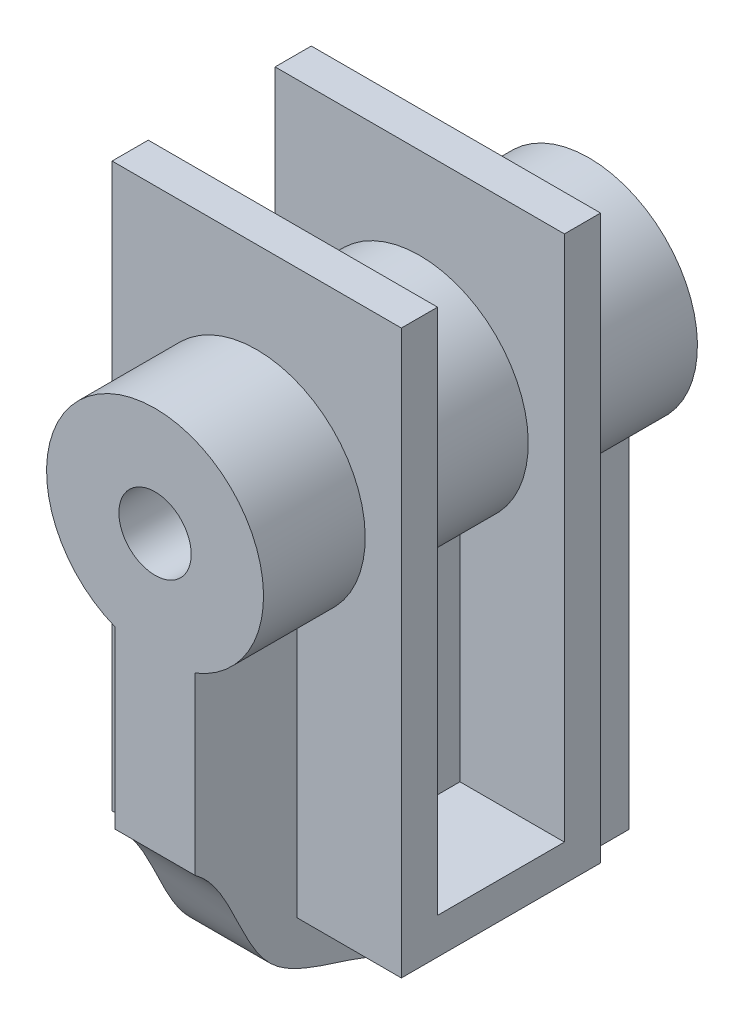
ISO-10303-21;
HEADER;
FILE_DESCRIPTION(('STEP AP214'),'2;1');
FILE_NAME('part.step','',(''),(''),'','','');
FILE_SCHEMA(('AUTOMOTIVE_DESIGN { 1 0 10303 214 1 1 1 1 }'));
ENDSEC;
DATA;
#1=APPLICATION_CONTEXT('core data for automotive mechanical design processes');
#2=APPLICATION_PROTOCOL_DEFINITION('international standard','automotive_design',2000,#1);
#3=PRODUCT_CONTEXT('',#1,'mechanical');
#4=PRODUCT('Part','Part','',(#3));
#5=PRODUCT_RELATED_PRODUCT_CATEGORY('part','',(#4));
#6=PRODUCT_DEFINITION_FORMATION('','',#4);
#7=PRODUCT_DEFINITION_CONTEXT('part definition',#1,'design');
#8=PRODUCT_DEFINITION('design','',#6,#7);
#9=PRODUCT_DEFINITION_SHAPE('','',#8);
#10=(LENGTH_UNIT() NAMED_UNIT(*) SI_UNIT(.MILLI.,.METRE.));
#11=(NAMED_UNIT(*) PLANE_ANGLE_UNIT() SI_UNIT($,.RADIAN.));
#12=(NAMED_UNIT(*) SI_UNIT($,.STERADIAN.) SOLID_ANGLE_UNIT());
#13=UNCERTAINTY_MEASURE_WITH_UNIT(LENGTH_MEASURE(1.E-05),#10,'distance_accuracy_value','');
#14=(GEOMETRIC_REPRESENTATION_CONTEXT(3) GLOBAL_UNCERTAINTY_ASSIGNED_CONTEXT((#13)) GLOBAL_UNIT_ASSIGNED_CONTEXT((#10,
#11,#12)) REPRESENTATION_CONTEXT('',''));
#15=CARTESIAN_POINT('',(0.,0.,0.));
#16=DIRECTION('',(0.,0.,1.));
#17=DIRECTION('',(1.,0.,0.));
#18=AXIS2_PLACEMENT_3D('',#15,#16,#17);
#19=CARTESIAN_POINT('',(-20.,-45.2531458099855,-6.6055019568257));
#20=DIRECTION('',(0.,1.,0.));
#21=DIRECTION('',(0.,0.,1.));
#22=AXIS2_PLACEMENT_3D('',#19,#20,#21);
#23=PLANE('',#22);
#24=DIRECTION('',(1.,0.,0.));
#25=VECTOR('',#24,1.);
#26=CARTESIAN_POINT('',(-20.,-45.2531458099855,10.9381302617935));
#27=LINE('',#26,#25);
#28=CARTESIAN_POINT('',(-20.,-45.2531458099855,10.9381302617935));
#29=VERTEX_POINT('',#28);
#30=CARTESIAN_POINT('',(20.,-45.2531458099855,10.9381302617935));
#31=VERTEX_POINT('',#30);
#32=EDGE_CURVE('E124',#29,#31,#27,.T.);
#33=ORIENTED_EDGE('',*,*,#32,.T.);
#34=DIRECTION('',(0.,0.,1.));
#35=VECTOR('',#34,1.);
#36=CARTESIAN_POINT('',(20.,-45.2531458099855,-6.6055019568257));
#37=LINE('',#36,#35);
#38=CARTESIAN_POINT('',(20.,-45.2531458099855,-6.6055019568257));
#39=VERTEX_POINT('',#38);
#40=EDGE_CURVE('E185',#39,#31,#37,.T.);
#41=ORIENTED_EDGE('',*,*,#40,.F.);
#42=DIRECTION('',(1.,0.,0.));
#43=VECTOR('',#42,1.);
#44=CARTESIAN_POINT('',(-20.,-45.2531458099855,-6.6055019568257));
#45=LINE('',#44,#43);
#46=CARTESIAN_POINT('',(-20.,-45.2531458099855,-6.6055019568257));
#47=VERTEX_POINT('',#46);
#48=EDGE_CURVE('E50',#47,#39,#45,.T.);
#49=ORIENTED_EDGE('',*,*,#48,.F.);
#50=DIRECTION('',(0.,0.,1.));
#51=VECTOR('',#50,1.);
#52=CARTESIAN_POINT('',(-20.,-45.2531458099855,-6.6055019568257));
#53=LINE('',#52,#51);
#54=EDGE_CURVE('E186',#47,#29,#53,.T.);
#55=ORIENTED_EDGE('',*,*,#54,.T.);
#56=EDGE_LOOP('',(#33,#41,#49,#55));
#57=FACE_BOUND('',#56,.T.);
#58=ADVANCED_FACE('F121',(#57),#23,.T.);
#59=CARTESIAN_POINT('',(-20.,-45.2531458099855,-6.6055019568257));
#60=DIRECTION('',(0.,0.,1.));
#61=DIRECTION('',(1.,0.,0.));
#62=AXIS2_PLACEMENT_3D('',#59,#60,#61);
#63=PLANE('',#62);
#64=ORIENTED_EDGE('',*,*,#48,.T.);
#65=DIRECTION('',(0.,-1.,0.));
#66=VECTOR('',#65,1.);
#67=CARTESIAN_POINT('',(20.,-45.2531458099855,-6.6055019568257));
#68=LINE('',#67,#66);
#69=CARTESIAN_POINT('',(20.,27.5804653060911,-6.6055019568257));
#70=VERTEX_POINT('',#69);
#71=EDGE_CURVE('E203',#70,#39,#68,.T.);
#72=ORIENTED_EDGE('',*,*,#71,.F.);
#73=DIRECTION('',(1.,0.,0.));
#74=VECTOR('',#73,1.);
#75=CARTESIAN_POINT('',(-20.,27.5804653060911,-6.6055019568257));
#76=LINE('',#75,#74);
#77=CARTESIAN_POINT('',(-20.,27.5804653060911,-6.6055019568257));
#78=VERTEX_POINT('',#77);
#79=EDGE_CURVE('E129',#78,#70,#76,.T.);
#80=ORIENTED_EDGE('',*,*,#79,.F.);
#81=DIRECTION('',(0.,-1.,0.));
#82=VECTOR('',#81,1.);
#83=CARTESIAN_POINT('',(-20.,-45.2531458099855,-6.6055019568257));
#84=LINE('',#83,#82);
#85=EDGE_CURVE('E191',#78,#47,#84,.T.);
#86=ORIENTED_EDGE('',*,*,#85,.T.);
#87=EDGE_LOOP('',(#64,#72,#80,#86));
#88=FACE_BOUND('',#87,.T.);
#89=ADVANCED_FACE('F267',(#88),#63,.T.);
#90=CARTESIAN_POINT('',(-20.,27.5804653060911,-6.6055019568257));
#91=DIRECTION('',(0.,1.,0.));
#92=DIRECTION('',(0.,0.,1.));
#93=AXIS2_PLACEMENT_3D('',#90,#91,#92);
#94=PLANE('',#93);
#95=ORIENTED_EDGE('',*,*,#79,.T.);
#96=DIRECTION('',(0.,0.,1.));
#97=VECTOR('',#96,1.);
#98=CARTESIAN_POINT('',(20.,27.5804653060911,-6.6055019568257));
#99=LINE('',#98,#97);
#100=CARTESIAN_POINT('',(20.,27.5804653060911,-11.6055019568257));
#101=VERTEX_POINT('',#100);
#102=EDGE_CURVE('E216',#101,#70,#99,.T.);
#103=ORIENTED_EDGE('',*,*,#102,.F.);
#104=DIRECTION('',(1.,0.,0.));
#105=VECTOR('',#104,1.);
#106=CARTESIAN_POINT('',(-20.,27.5804653060911,-11.6055019568257));
#107=LINE('',#106,#105);
#108=CARTESIAN_POINT('',(-20.,27.5804653060911,-11.6055019568257));
#109=VERTEX_POINT('',#108);
#110=EDGE_CURVE('E238',#109,#101,#107,.T.);
#111=ORIENTED_EDGE('',*,*,#110,.F.);
#112=DIRECTION('',(0.,0.,1.));
#113=VECTOR('',#112,1.);
#114=CARTESIAN_POINT('',(-20.,27.5804653060911,-6.6055019568257));
#115=LINE('',#114,#113);
#116=EDGE_CURVE('E234',#109,#78,#115,.T.);
#117=ORIENTED_EDGE('',*,*,#116,.T.);
#118=EDGE_LOOP('',(#95,#103,#111,#117));
#119=FACE_BOUND('',#118,.T.);
#120=ADVANCED_FACE('F266',(#119),#94,.T.);
#121=CARTESIAN_POINT('',(-20.,-50.2531458099855,-11.6055019568257));
#122=DIRECTION('',(0.,0.,-1.));
#123=DIRECTION('',(-1.,0.,0.));
#124=AXIS2_PLACEMENT_3D('',#121,#122,#123);
#125=PLANE('',#124);
#126=ORIENTED_EDGE('',*,*,#110,.T.);
#127=DIRECTION('',(0.,1.,0.));
#128=VECTOR('',#127,1.);
#129=CARTESIAN_POINT('',(20.,-50.2531458099855,-11.6055019568257));
#130=LINE('',#129,#128);
#131=CARTESIAN_POINT('',(20.,-50.2531458099855,-11.6055019568257));
#132=VERTEX_POINT('',#131);
#133=EDGE_CURVE('E213',#132,#101,#130,.T.);
#134=ORIENTED_EDGE('',*,*,#133,.F.);
#135=DIRECTION('',(1.,0.,0.));
#136=VECTOR('',#135,1.);
#137=CARTESIAN_POINT('',(-20.,-50.2531458099855,-11.6055019568257));
#138=LINE('',#137,#136);
#139=CARTESIAN_POINT('',(-20.,-50.2531458099855,-11.6055019568257));
#140=VERTEX_POINT('',#139);
#141=EDGE_CURVE('E240',#140,#132,#138,.T.);
#142=ORIENTED_EDGE('',*,*,#141,.F.);
#143=DIRECTION('',(0.,1.,0.));
#144=VECTOR('',#143,1.);
#145=CARTESIAN_POINT('',(-20.,-50.2531458099855,-11.6055019568257));
#146=LINE('',#145,#144);
#147=EDGE_CURVE('E231',#140,#109,#146,.T.);
#148=ORIENTED_EDGE('',*,*,#147,.T.);
#149=EDGE_LOOP('',(#126,#134,#142,#148));
#150=FACE_BOUND('',#149,.T.);
#151=ADVANCED_FACE('F262',(#150),#125,.T.);
#152=CARTESIAN_POINT('',(-20.,-50.2531458099855,-11.6055019568257));
#153=DIRECTION('',(0.,-1.,0.));
#154=DIRECTION('',(0.,0.,-1.));
#155=AXIS2_PLACEMENT_3D('',#152,#153,#154);
#156=PLANE('',#155);
#157=ORIENTED_EDGE('',*,*,#141,.T.);
#158=DIRECTION('',(0.,0.,-1.));
#159=VECTOR('',#158,1.);
#160=CARTESIAN_POINT('',(20.,-50.2531458099855,-11.6055019568257));
#161=LINE('',#160,#159);
#162=CARTESIAN_POINT('',(20.,-50.2531458099855,15.9381302617935));
#163=VERTEX_POINT('',#162);
#164=EDGE_CURVE('E210',#163,#132,#161,.T.);
#165=ORIENTED_EDGE('',*,*,#164,.F.);
#166=DIRECTION('',(1.,0.,0.));
#167=VECTOR('',#166,1.);
#168=CARTESIAN_POINT('',(-20.,-50.2531458099855,15.9381302617935));
#169=LINE('',#168,#167);
#170=CARTESIAN_POINT('',(-20.,-50.2531458099855,15.9381302617935));
#171=VERTEX_POINT('',#170);
#172=EDGE_CURVE('E242',#171,#163,#169,.T.);
#173=ORIENTED_EDGE('',*,*,#172,.F.);
#174=DIRECTION('',(0.,0.,-1.));
#175=VECTOR('',#174,1.);
#176=CARTESIAN_POINT('',(-20.,-50.2531458099855,-11.6055019568257));
#177=LINE('',#176,#175);
#178=EDGE_CURVE('E228',#171,#140,#177,.T.);
#179=ORIENTED_EDGE('',*,*,#178,.T.);
#180=EDGE_LOOP('',(#157,#165,#173,#179));
#181=FACE_BOUND('',#180,.T.);
#182=ADVANCED_FACE('F255',(#181),#156,.T.);
#183=CARTESIAN_POINT('',(-20.,-50.2531458099855,15.9381302617935));
#184=DIRECTION('',(0.,0.,1.));
#185=DIRECTION('',(1.,0.,0.));
#186=AXIS2_PLACEMENT_3D('',#183,#184,#185);
#187=PLANE('',#186);
#188=ORIENTED_EDGE('',*,*,#172,.T.);
#189=DIRECTION('',(0.,-1.,0.));
#190=VECTOR('',#189,1.);
#191=CARTESIAN_POINT('',(20.,-50.2531458099855,15.9381302617935));
#192=LINE('',#191,#190);
#193=CARTESIAN_POINT('',(20.,27.5804653060911,15.9381302617935));
#194=VERTEX_POINT('',#193);
#195=EDGE_CURVE('E207',#194,#163,#192,.T.);
#196=ORIENTED_EDGE('',*,*,#195,.F.);
#197=DIRECTION('',(1.,0.,0.));
#198=VECTOR('',#197,1.);
#199=CARTESIAN_POINT('',(-20.,27.5804653060911,15.9381302617935));
#200=LINE('',#199,#198);
#201=CARTESIAN_POINT('',(-20.,27.5804653060911,15.9381302617935));
#202=VERTEX_POINT('',#201);
#203=EDGE_CURVE('E244',#202,#194,#200,.T.);
#204=ORIENTED_EDGE('',*,*,#203,.F.);
#205=DIRECTION('',(0.,-1.,0.));
#206=VECTOR('',#205,1.);
#207=CARTESIAN_POINT('',(-20.,-50.2531458099855,15.9381302617935));
#208=LINE('',#207,#206);
#209=EDGE_CURVE('E225',#202,#171,#208,.T.);
#210=ORIENTED_EDGE('',*,*,#209,.T.);
#211=EDGE_LOOP('',(#188,#196,#204,#210));
#212=FACE_BOUND('',#211,.T.);
#213=ADVANCED_FACE('F252',(#212),#187,.T.);
#214=CARTESIAN_POINT('',(-20.,27.5804653060911,15.9381302617935));
#215=DIRECTION('',(0.,1.,0.));
#216=DIRECTION('',(0.,0.,1.));
#217=AXIS2_PLACEMENT_3D('',#214,#215,#216);
#218=PLANE('',#217);
#219=ORIENTED_EDGE('',*,*,#203,.T.);
#220=DIRECTION('',(0.,0.,1.));
#221=VECTOR('',#220,1.);
#222=CARTESIAN_POINT('',(20.,27.5804653060911,15.9381302617935));
#223=LINE('',#222,#221);
#224=CARTESIAN_POINT('',(20.,27.5804653060911,10.9381302617935));
#225=VERTEX_POINT('',#224);
#226=EDGE_CURVE('E198',#225,#194,#223,.T.);
#227=ORIENTED_EDGE('',*,*,#226,.F.);
#228=DIRECTION('',(1.,0.,0.));
#229=VECTOR('',#228,1.);
#230=CARTESIAN_POINT('',(-20.,27.5804653060911,10.9381302617935));
#231=LINE('',#230,#229);
#232=CARTESIAN_POINT('',(-20.,27.5804653060911,10.9381302617935));
#233=VERTEX_POINT('',#232);
#234=EDGE_CURVE('E190',#233,#225,#231,.T.);
#235=ORIENTED_EDGE('',*,*,#234,.F.);
#236=DIRECTION('',(0.,0.,1.));
#237=VECTOR('',#236,1.);
#238=CARTESIAN_POINT('',(-20.,27.5804653060911,15.9381302617935));
#239=LINE('',#238,#237);
#240=EDGE_CURVE('E222',#233,#202,#239,.T.);
#241=ORIENTED_EDGE('',*,*,#240,.T.);
#242=EDGE_LOOP('',(#219,#227,#235,#241));
#243=FACE_BOUND('',#242,.T.);
#244=ADVANCED_FACE('F246',(#243),#218,.T.);
#245=CARTESIAN_POINT('',(-20.,-45.2531458099855,10.9381302617935));
#246=DIRECTION('',(0.,0.,-1.));
#247=DIRECTION('',(-1.,0.,0.));
#248=AXIS2_PLACEMENT_3D('',#245,#246,#247);
#249=PLANE('',#248);
#250=ORIENTED_EDGE('',*,*,#234,.T.);
#251=DIRECTION('',(0.,1.,0.));
#252=VECTOR('',#251,1.);
#253=CARTESIAN_POINT('',(20.,-45.2531458099855,10.9381302617935));
#254=LINE('',#253,#252);
#255=EDGE_CURVE('E193',#31,#225,#254,.T.);
#256=ORIENTED_EDGE('',*,*,#255,.F.);
#257=ORIENTED_EDGE('',*,*,#32,.F.);
#258=DIRECTION('',(0.,1.,0.));
#259=VECTOR('',#258,1.);
#260=CARTESIAN_POINT('',(-20.,-45.2531458099855,10.9381302617935));
#261=LINE('',#260,#259);
#262=EDGE_CURVE('E220',#29,#233,#261,.T.);
#263=ORIENTED_EDGE('',*,*,#262,.T.);
#264=EDGE_LOOP('',(#250,#256,#257,#263));
#265=FACE_BOUND('',#264,.T.);
#266=ADVANCED_FACE('F194',(#265),#249,.T.);
#267=CARTESIAN_POINT('',(-20.,0.,-70.));
#268=DIRECTION('',(-1.,0.,0.));
#269=DIRECTION('',(0.,0.,1.));
#270=AXIS2_PLACEMENT_3D('',#267,#268,#269);
#271=PLANE('',#270);
#272=ORIENTED_EDGE('',*,*,#54,.F.);
#273=ORIENTED_EDGE('',*,*,#85,.F.);
#274=ORIENTED_EDGE('',*,*,#116,.F.);
#275=ORIENTED_EDGE('',*,*,#147,.F.);
#276=ORIENTED_EDGE('',*,*,#178,.F.);
#277=ORIENTED_EDGE('',*,*,#209,.F.);
#278=ORIENTED_EDGE('',*,*,#240,.F.);
#279=ORIENTED_EDGE('',*,*,#262,.F.);
#280=EDGE_LOOP('',(#272,#273,#274,#275,#276,#277,#278,#279));
#281=FACE_BOUND('',#280,.T.);
#282=ADVANCED_FACE('F258',(#281),#271,.T.);
#283=CARTESIAN_POINT('',(20.,0.,-70.));
#284=DIRECTION('',(-1.,0.,0.));
#285=DIRECTION('',(0.,0.,1.));
#286=AXIS2_PLACEMENT_3D('',#283,#284,#285);
#287=PLANE('',#286);
#288=ORIENTED_EDGE('',*,*,#40,.T.);
#289=ORIENTED_EDGE('',*,*,#255,.T.);
#290=ORIENTED_EDGE('',*,*,#226,.T.);
#291=ORIENTED_EDGE('',*,*,#195,.T.);
#292=ORIENTED_EDGE('',*,*,#164,.T.);
#293=ORIENTED_EDGE('',*,*,#133,.T.);
#294=ORIENTED_EDGE('',*,*,#102,.T.);
#295=ORIENTED_EDGE('',*,*,#71,.T.);
#296=EDGE_LOOP('',(#288,#289,#290,#291,#292,#293,#294,#295));
#297=FACE_BOUND('',#296,.T.);
#298=ADVANCED_FACE('F201',(#297),#287,.F.);
#299=CLOSED_SHELL('',(#58,#89,#120,#151,#182,#213,#244,#266,#282,#298));
#300=MANIFOLD_SOLID_BREP('B6',#299);
#301=CARTESIAN_POINT('',(5.5576064521285,-13.9324445279089,-30.));
#302=DIRECTION('',(1.,0.,0.));
#303=DIRECTION('',(0.,1.,0.));
#304=AXIS2_PLACEMENT_3D('',#301,#302,#303);
#305=PLANE('',#304);
#306=DIRECTION('',(0.,1.,0.));
#307=VECTOR('',#306,1.);
#308=CARTESIAN_POINT('',(5.5576064521285,-13.9324445279089,30.));
#309=LINE('',#308,#307);
#310=CARTESIAN_POINT('',(5.5576064521285,-38.1621288129392,30.));
#311=VERTEX_POINT('',#310);
#312=CARTESIAN_POINT('',(5.5576064521285,-13.9324445279089,30.));
#313=VERTEX_POINT('',#312);
#314=EDGE_CURVE('E411',#311,#313,#309,.T.);
#315=ORIENTED_EDGE('',*,*,#314,.F.);
#316=CARTESIAN_POINT('',(5.5576064521285,-38.162128812939,30.0000000000001));
#317=CARTESIAN_POINT('',(5.5576064521285,-38.2390356697093,29.8932156569232));
#318=CARTESIAN_POINT('',(5.5576064521285,-38.3180935265017,29.7880025490872));
#319=CARTESIAN_POINT('',(5.5576064521285,-38.4802518566458,29.5807654114079));
#320=CARTESIAN_POINT('',(5.5576064521285,-38.56335166793,29.4787408637492));
#321=CARTESIAN_POINT('',(5.5576064521285,-38.81757188996,29.1784040563975));
#322=CARTESIAN_POINT('',(5.5576064521285,-38.9943342558284,28.9848334944389));
#323=CARTESIAN_POINT('',(5.5576064521285,-39.3604515569888,28.6105681302833));
#324=CARTESIAN_POINT('',(5.5576064521285,-39.5497904730152,28.4298575335943));
#325=CARTESIAN_POINT('',(5.5576064521285,-39.9352725684418,28.0838762866036));
#326=CARTESIAN_POINT('',(5.5576064521285,-40.1312048756993,27.9183696646933));
#327=CARTESIAN_POINT('',(5.5576064521285,-40.5317121870961,27.5977867919598));
#328=CARTESIAN_POINT('',(5.5576064521285,-40.7362958300207,27.4427213876911));
#329=CARTESIAN_POINT('',(5.5576064521285,-41.152390227305,27.1420697138918));
#330=CARTESIAN_POINT('',(5.5576064521285,-41.363903452875,26.996486882554));
#331=CARTESIAN_POINT('',(5.5576064521285,-41.8523346456861,26.6741365107189));
#332=CARTESIAN_POINT('',(5.5576064521285,-42.1310043153771,26.5000309952204));
#333=CARTESIAN_POINT('',(5.5576064521285,-42.6948931228931,26.1630220700723));
#334=CARTESIAN_POINT('',(5.5576064521285,-42.9801108025325,26.000116198025));
#335=CARTESIAN_POINT('',(5.5576064521285,-43.5553064677531,25.6829641473879));
#336=CARTESIAN_POINT('',(5.5576064521285,-43.8452846583786,25.5287183430752));
#337=CARTESIAN_POINT('',(5.5576064521285,-44.431265247978,25.2250503381148));
#338=CARTESIAN_POINT('',(5.5576064521285,-44.7272987500749,25.0756885766084));
#339=CARTESIAN_POINT('',(5.5576064521285,-45.3213149264399,24.7810015965398));
#340=CARTESIAN_POINT('',(5.5576064521285,-45.6192973857167,24.635675941729));
#341=CARTESIAN_POINT('',(5.5576064521285,-46.2160880606755,24.3467368814545));
#342=CARTESIAN_POINT('',(5.5576064521285,-46.514896280846,24.2031234853205));
#343=CARTESIAN_POINT('',(5.5576064521285,-47.0553109454691,23.9427512787087));
#344=CARTESIAN_POINT('',(5.5576064521285,-47.296964782588,23.826091249524));
#345=CARTESIAN_POINT('',(5.5576064521285,-47.7794920738743,23.5911748814192));
#346=CARTESIAN_POINT('',(5.5576064521285,-48.0203655452178,23.4729185779337));
#347=CARTESIAN_POINT('',(5.5576064521285,-48.5007154393345,23.233546927066));
#348=CARTESIAN_POINT('',(5.5576064521285,-48.7401917611856,23.1124313762602));
#349=CARTESIAN_POINT('',(5.5576064521285,-49.2170975329748,22.8660098648867));
#350=CARTESIAN_POINT('',(5.5576064521285,-49.4545262184846,22.7407024179066));
#351=CARTESIAN_POINT('',(5.5576064521285,-49.9246889047321,22.4855227482267));
#352=CARTESIAN_POINT('',(5.5576064521285,-50.1574445297613,22.3556905555566));
#353=CARTESIAN_POINT('',(5.5576064521285,-50.6190497028233,22.0892281820119));
#354=CARTESIAN_POINT('',(5.5576064521285,-50.8478992838646,21.9525980586221));
#355=CARTESIAN_POINT('',(5.5576064521285,-51.3004362816496,21.671160974459));
#356=CARTESIAN_POINT('',(5.5576064521285,-51.5241253331357,21.5263566546197));
#357=CARTESIAN_POINT('',(5.5576064521285,-51.9650241191155,21.2270604883043));
#358=CARTESIAN_POINT('',(5.5576064521285,-52.1822328813918,21.0725671989009));
#359=CARTESIAN_POINT('',(5.5576064521285,-52.5472320327118,20.7984527516213));
#360=CARTESIAN_POINT('',(5.5576064521285,-52.6970593008714,20.6815438081119));
#361=CARTESIAN_POINT('',(5.5576064521285,-52.9917806998285,20.4416430857625));
#362=CARTESIAN_POINT('',(5.5576064521285,-53.136674832653,20.3186513094219));
#363=CARTESIAN_POINT('',(5.5576064521285,-53.4206372945255,20.0662586006321));
#364=CARTESIAN_POINT('',(5.5576064521285,-53.5597088702142,19.9368613301393));
#365=CARTESIAN_POINT('',(5.5576064521285,-53.8311766717152,19.6713663279983));
#366=CARTESIAN_POINT('',(5.5576064521285,-53.9635765187155,19.5352723121594));
#367=CARTESIAN_POINT('',(5.5576064521285,-54.2206270455287,19.2563551878688));
#368=CARTESIAN_POINT('',(5.5576064521285,-54.3452898710311,19.1135432784799));
#369=CARTESIAN_POINT('',(5.5576064521285,-54.5872246449341,18.8216711204131));
#370=CARTESIAN_POINT('',(5.5576064521285,-54.7044923477381,18.6726073628072));
#371=CARTESIAN_POINT('',(5.5576064521285,-54.9318678205941,18.3690094127681));
#372=CARTESIAN_POINT('',(5.5576064521285,-55.041971952394,18.214472501204));
#373=CARTESIAN_POINT('',(5.5576064521285,-55.2552913175542,17.9007492085909));
#374=CARTESIAN_POINT('',(5.5576064521285,-55.3585070246038,17.7415631483295));
#375=CARTESIAN_POINT('',(5.5576064521285,-55.6240705301056,17.3134912217004));
#376=CARTESIAN_POINT('',(5.5576064521285,-55.7808124312108,17.0411186317341));
#377=CARTESIAN_POINT('',(5.5576064521285,-56.0788805628699,16.4880594803882));
#378=CARTESIAN_POINT('',(5.5576064521285,-56.2202023343614,16.2073705438368));
#379=CARTESIAN_POINT('',(5.5576064521285,-56.4899212110672,15.6395966624294));
#380=CARTESIAN_POINT('',(5.5576064521285,-56.6183071033885,15.3525064276762));
#381=CARTESIAN_POINT('',(5.5576064521285,-56.8644201061225,14.7737883647159));
#382=CARTESIAN_POINT('',(5.5576064521285,-56.9821458674491,14.4821599676419));
#383=CARTESIAN_POINT('',(5.5576064521285,-57.2108595814445,13.8914391888251));
#384=CARTESIAN_POINT('',(5.5576064521285,-57.3217253707133,13.5922998663514));
#385=CARTESIAN_POINT('',(5.5576064521285,-57.5370127609398,12.9919846918133));
#386=CARTESIAN_POINT('',(5.5576064521285,-57.6414391715037,12.6908105507955));
#387=CARTESIAN_POINT('',(5.5576064521285,-57.8460409595757,12.0871320210797));
#388=CARTESIAN_POINT('',(5.5576064521285,-57.9462175890702,11.7846280535421));
#389=CARTESIAN_POINT('',(5.5576064521285,-58.1443705031992,11.1789504729972));
#390=CARTESIAN_POINT('',(5.5576064521285,-58.2423470794864,10.8757769546726));
#391=CARTESIAN_POINT('',(5.5576064521285,-58.486789625299,10.1184469191766));
#392=CARTESIAN_POINT('',(5.5576064521285,-58.6331187084805,9.66424612682074));
#393=CARTESIAN_POINT('',(5.5576064521285,-58.9318264571351,8.75769559851139));
#394=CARTESIAN_POINT('',(5.5576064521285,-59.0842064521975,8.30534629374904));
#395=CARTESIAN_POINT('',(5.5576064521285,-59.401807964397,7.40449492511458));
#396=CARTESIAN_POINT('',(5.5576064521285,-59.5670446919093,6.95599813721423));
#397=CARTESIAN_POINT('',(5.5576064521285,-59.9146141257867,6.07314424093666));
#398=CARTESIAN_POINT('',(5.5576064521285,-60.0966603418787,5.6386762180847));
#399=CARTESIAN_POINT('',(5.5576064521285,-60.4866287879703,4.7818715273882));
#400=CARTESIAN_POINT('',(5.5576064521285,-60.6945248227801,4.35952310381369));
#401=CARTESIAN_POINT('',(5.5576064521285,-61.142914235248,3.53326310956838));
#402=CARTESIAN_POINT('',(5.5576064521285,-61.3833387853394,3.12931495486531));
#403=CARTESIAN_POINT('',(5.5576064521285,-61.7952102425505,2.50926046618572));
#404=CARTESIAN_POINT('',(5.5576064521285,-61.9539355346683,2.28470227482413));
#405=CARTESIAN_POINT('',(5.5576064521285,-62.2031779655602,1.95507777710684));
#406=CARTESIAN_POINT('',(5.5576064521285,-62.2884439152264,1.8460271402991));
#407=CARTESIAN_POINT('',(5.5576064521285,-62.4626156626145,1.63086777537261));
#408=CARTESIAN_POINT('',(5.5576064521285,-62.5515215832558,1.52475914680677));
#409=CARTESIAN_POINT('',(5.5576064521285,-62.642280007554,1.42024216723639));
#410=B_SPLINE_CURVE_WITH_KNOTS('',3,(#316,#317,#318,#319,#320,#321,#322,#323,#324,#325,#326,
#327,#328,#329,#330,#331,#332,#333,#334,#335,#336,#337,#338,#339,#340,#341,#342,#343,#344,#345,
#346,#347,#348,#349,#350,#351,#352,#353,#354,#355,#356,#357,#358,#359,#360,#361,#362,#363,#364,
#365,#366,#367,#368,#369,#370,#371,#372,#373,#374,#375,#376,#377,#378,#379,#380,#381,#382,#383,
#384,#385,#386,#387,#388,#389,#390,#391,#392,#393,#394,#395,#396,#397,#398,#399,#400,#401,#402,
#403,#404,#405,#406,#407,#408,#409),.UNSPECIFIED.,.F.,.F.,(4,2,2,2,2,2,2,2,2,2,2,2,2,2,2,2,2,2,
2,2,2,2,2,2,2,2,2,2,2,2,2,2,2,2,2,2,2,2,2,2,2,2,2,2,2,2,4),(0.,0.394729970486916,
0.789395500994888,1.5750495323275,2.35972135370753,3.12875155870454,3.89856870136028,
4.66866342830044,5.65407913956631,6.63927749595816,7.62451839864336,8.61920713977163,
9.61378794674,10.6083741704187,11.4133913268768,12.2183906426453,13.0234474044137,
13.8287927234215,14.6282553022924,15.4277111218549,16.2269101138616,17.0262284103093,
17.5962157844879,18.1662029244631,18.7358678892861,19.3052202532634,19.8736549706172,
20.4424131142361,21.0114579008817,21.5804635162002,22.5225809797653,23.4649701588747,
24.4081693030331,25.3514876468091,26.308457460538,27.2647036276782,28.2206660999603,
29.1765010867887,30.6080695922016,32.0399544212616,33.4735598048514,34.8861255841463,
36.2972714159145,37.7054767655484,38.5299221611118,38.9451336429348,39.3603591577522),.UNSPECIFIED.);
#411=CARTESIAN_POINT('',(5.5576064521285,-62.6422800075539,1.42024216723646));
#412=VERTEX_POINT('',#411);
#413=EDGE_CURVE('E363',#311,#412,#410,.T.);
#414=ORIENTED_EDGE('',*,*,#413,.T.);
#415=DIRECTION('',(0.,0.,1.));
#416=VECTOR('',#415,1.);
#417=CARTESIAN_POINT('',(5.5576064521285,-62.6422800075539,-30.));
#418=LINE('',#417,#416);
#419=CARTESIAN_POINT('',(5.5576064521285,-62.6422800075539,-30.));
#420=VERTEX_POINT('',#419);
#421=EDGE_CURVE('E433',#420,#412,#418,.T.);
#422=ORIENTED_EDGE('',*,*,#421,.F.);
#423=DIRECTION('',(0.,1.,0.));
#424=VECTOR('',#423,1.);
#425=CARTESIAN_POINT('',(5.5576064521285,-13.9324445279089,-30.));
#426=LINE('',#425,#424);
#427=CARTESIAN_POINT('',(5.5576064521285,-13.9324445279089,-30.));
#428=VERTEX_POINT('',#427);
#429=EDGE_CURVE('E428',#420,#428,#426,.T.);
#430=ORIENTED_EDGE('',*,*,#429,.T.);
#431=DIRECTION('',(0.,0.,1.));
#432=VECTOR('',#431,1.);
#433=CARTESIAN_POINT('',(5.5576064521285,-13.9324445279089,-30.));
#434=LINE('',#433,#432);
#435=EDGE_CURVE('E356',#428,#313,#434,.T.);
#436=ORIENTED_EDGE('',*,*,#435,.T.);
#437=EDGE_LOOP('',(#315,#414,#422,#430,#436));
#438=FACE_BOUND('',#437,.T.);
#439=ADVANCED_FACE('F348',(#438),#305,.T.);
#440=CARTESIAN_POINT('',(-5.5576064521285,-62.6422800075539,-30.));
#441=DIRECTION('',(0.,-1.,0.));
#442=DIRECTION('',(0.,0.,-1.));
#443=AXIS2_PLACEMENT_3D('',#440,#441,#442);
#444=PLANE('',#443);
#445=ORIENTED_EDGE('',*,*,#421,.T.);
#446=DIRECTION('',(1.,0.,0.));
#447=VECTOR('',#446,1.);
#448=CARTESIAN_POINT('',(0.,-62.6422800075539,1.42024216723646));
#449=LINE('',#448,#447);
#450=CARTESIAN_POINT('',(-5.5576064521285,-62.6422800075539,1.42024216723637));
#451=VERTEX_POINT('',#450);
#452=EDGE_CURVE('E407',#412,#451,#449,.F.);
#453=ORIENTED_EDGE('',*,*,#452,.T.);
#454=DIRECTION('',(0.,0.,1.));
#455=VECTOR('',#454,1.);
#456=CARTESIAN_POINT('',(-5.5576064521285,-62.6422800075539,-30.));
#457=LINE('',#456,#455);
#458=CARTESIAN_POINT('',(-5.5576064521285,-62.6422800075539,-30.));
#459=VERTEX_POINT('',#458);
#460=EDGE_CURVE('E406',#459,#451,#457,.T.);
#461=ORIENTED_EDGE('',*,*,#460,.F.);
#462=DIRECTION('',(1.,0.,0.));
#463=VECTOR('',#462,1.);
#464=CARTESIAN_POINT('',(-5.5576064521285,-62.6422800075539,-30.));
#465=LINE('',#464,#463);
#466=EDGE_CURVE('E425',#459,#420,#465,.T.);
#467=ORIENTED_EDGE('',*,*,#466,.T.);
#468=EDGE_LOOP('',(#445,#453,#461,#467));
#469=FACE_BOUND('',#468,.T.);
#470=ADVANCED_FACE('F442',(#469),#444,.T.);
#471=CARTESIAN_POINT('',(-5.5576064521285,-13.9324445279089,-30.));
#472=DIRECTION('',(-1.,0.,0.));
#473=DIRECTION('',(0.,0.,1.));
#474=AXIS2_PLACEMENT_3D('',#471,#472,#473);
#475=PLANE('',#474);
#476=ORIENTED_EDGE('',*,*,#460,.T.);
#477=CARTESIAN_POINT('',(-5.5576064521285,-62.6422800075539,1.42024216723637));
#478=CARTESIAN_POINT('',(-5.5576064521285,-62.5176472780284,1.56375624980629));
#479=CARTESIAN_POINT('',(-5.5576064521285,-62.3965194507304,1.71027694907435));
#480=CARTESIAN_POINT('',(-5.5576064521285,-62.1611188732568,2.00864464980485));
#481=CARTESIAN_POINT('',(-5.5576064521285,-62.0468436645718,2.16048970968874));
#482=CARTESIAN_POINT('',(-5.5576064521285,-61.8266398713068,2.46651121909632));
#483=CARTESIAN_POINT('',(-5.5576064521285,-61.7206086815497,2.62061403800985));
#484=CARTESIAN_POINT('',(-5.5576064521285,-61.5146526445213,2.9328527654522));
#485=CARTESIAN_POINT('',(-5.5576064521285,-61.4147283377893,3.09098902924298));
#486=CARTESIAN_POINT('',(-5.5576064521285,-61.1251896231754,3.56803699932292));
#487=CARTESIAN_POINT('',(-5.5576064521285,-60.9440253340075,3.89210163985537));
#488=CARTESIAN_POINT('',(-5.5576064521285,-60.6018065943958,4.54930704807927));
#489=CARTESIAN_POINT('',(-5.5576064521285,-60.4406938295618,4.88241789346991));
#490=CARTESIAN_POINT('',(-5.5576064521285,-60.1345283488858,5.55586414824773));
#491=CARTESIAN_POINT('',(-5.5576064521285,-59.989474937074,5.89619924379268));
#492=CARTESIAN_POINT('',(-5.5576064521285,-59.7095762613506,6.58800889288327));
#493=CARTESIAN_POINT('',(-5.5576064521285,-59.5749571380415,6.93957399050714));
#494=CARTESIAN_POINT('',(-5.5576064521285,-59.3150836082193,7.64698821186142));
#495=CARTESIAN_POINT('',(-5.5576064521285,-59.1898503875174,8.00284504012952));
#496=CARTESIAN_POINT('',(-5.5576064521285,-58.9455068984731,8.71734900369193));
#497=CARTESIAN_POINT('',(-5.5576064521285,-58.8264080693909,9.0760000113601));
#498=CARTESIAN_POINT('',(-5.5576064521285,-58.5912033285362,9.79463271142257));
#499=CARTESIAN_POINT('',(-5.5576064521285,-58.4751002380248,10.1546153175469));
#500=CARTESIAN_POINT('',(-5.5576064521285,-58.2427847395248,10.8744612754596));
#501=CARTESIAN_POINT('',(-5.5576064521285,-58.1265723604593,11.2343246362357));
#502=CARTESIAN_POINT('',(-5.5576064521285,-57.9222365041432,11.8569128538219));
#503=CARTESIAN_POINT('',(-5.5576064521285,-57.8349061956867,12.1198963346254));
#504=CARTESIAN_POINT('',(-5.5576064521285,-57.657129889454,12.6446016470952));
#505=CARTESIAN_POINT('',(-5.5576064521285,-57.5666861959522,12.9063242550898));
#506=CARTESIAN_POINT('',(-5.5576064521285,-57.3812579346402,13.4280805193278));
#507=CARTESIAN_POINT('',(-5.5576064521285,-57.2862746820724,13.6881146402705));
#508=CARTESIAN_POINT('',(-5.5576064521285,-57.090238356975,14.2060311570101));
#509=CARTESIAN_POINT('',(-5.5576064521285,-56.9891826015254,14.4639125435337));
#510=CARTESIAN_POINT('',(-5.5576064521285,-56.7809857420488,14.9729666187235));
#511=CARTESIAN_POINT('',(-5.5576064521285,-56.6739510959372,15.2241825940839));
#512=CARTESIAN_POINT('',(-5.5576064521285,-56.4509645046147,15.7227004667281));
#513=CARTESIAN_POINT('',(-5.5576064521285,-56.3350110925508,15.9700017120639));
#514=CARTESIAN_POINT('',(-5.5576064521285,-56.0926716779985,16.4593444053179));
#515=CARTESIAN_POINT('',(-5.5576064521285,-55.9662898584471,16.7013879134258));
#516=CARTESIAN_POINT('',(-5.5576064521285,-55.7014826135087,17.1788430945345));
#517=CARTESIAN_POINT('',(-5.5576064521285,-55.5630574387557,17.4142549054125));
#518=CARTESIAN_POINT('',(-5.5576064521285,-55.3124025719355,17.8134463963207));
#519=CARTESIAN_POINT('',(-5.5576064521285,-55.2033508606291,17.9792220516169));
#520=CARTESIAN_POINT('',(-5.5576064521285,-54.9776472747188,18.3055350300015));
#521=CARTESIAN_POINT('',(-5.5576064521285,-54.8609953311749,18.4660723055539));
#522=CARTESIAN_POINT('',(-5.5576064521285,-54.6197739503446,18.780967742221));
#523=CARTESIAN_POINT('',(-5.5576064521285,-54.4952091002455,18.935329400316));
#524=CARTESIAN_POINT('',(-5.5576064521285,-54.3022688508556,19.1615836395082));
#525=CARTESIAN_POINT('',(-5.5576064521285,-54.2369564646701,19.2361029671458));
#526=CARTESIAN_POINT('',(-5.5576064521285,-54.104262324928,19.3832756773387));
#527=CARTESIAN_POINT('',(-5.5576064521285,-54.0368805806248,19.4559290682351));
#528=CARTESIAN_POINT('',(-5.5576064521285,-53.8315616189492,19.6712868835348));
#529=CARTESIAN_POINT('',(-5.5576064521285,-53.6906427566816,19.8111638726514));
#530=CARTESIAN_POINT('',(-5.5576064521285,-53.4018608030607,20.0837035027849));
#531=CARTESIAN_POINT('',(-5.5576064521285,-53.2539933254157,20.2163614696475));
#532=CARTESIAN_POINT('',(-5.5576064521285,-52.9522584233537,20.4748470505819));
#533=CARTESIAN_POINT('',(-5.5576064521285,-52.7983873463721,20.6006703915422));
#534=CARTESIAN_POINT('',(-5.5576064521285,-52.4856315736009,20.8458792549114));
#535=CARTESIAN_POINT('',(-5.5576064521285,-52.326747100995,20.9652650632638));
#536=CARTESIAN_POINT('',(-5.5576064521285,-51.8846597675405,21.2850196754778));
#537=CARTESIAN_POINT('',(-5.5576064521285,-51.5971094461581,21.4793855452575));
#538=CARTESIAN_POINT('',(-5.5576064521285,-51.0126542147425,21.8533365002499));
#539=CARTESIAN_POINT('',(-5.5576064521285,-50.7157488430203,22.0329208543825));
#540=CARTESIAN_POINT('',(-5.5576064521285,-50.1150347686988,22.3806172866707));
#541=CARTESIAN_POINT('',(-5.5576064521285,-49.8112208880845,22.5487203545276));
#542=CARTESIAN_POINT('',(-5.5576064521285,-49.1989741145987,22.8763618627937));
#543=CARTESIAN_POINT('',(-5.5576064521285,-48.8905403524931,23.0358986648934));
#544=CARTESIAN_POINT('',(-5.5576064521285,-48.2676133351515,23.3508603135076));
#545=CARTESIAN_POINT('',(-5.5576064521285,-47.9530903844584,23.506225994416));
#546=CARTESIAN_POINT('',(-5.5576064521285,-47.3228030389596,23.8138283021802));
#547=CARTESIAN_POINT('',(-5.5576064521285,-47.0070396725599,23.9660670523765));
#548=CARTESIAN_POINT('',(-5.5576064521285,-46.3754836353655,24.2702017733977));
#549=CARTESIAN_POINT('',(-5.5576064521285,-46.0596910125434,24.4220978446287));
#550=CARTESIAN_POINT('',(-5.5576064521285,-45.429270768208,24.7282966973307));
#551=CARTESIAN_POINT('',(-5.5576064521285,-45.1146431312727,24.8825994468003));
#552=CARTESIAN_POINT('',(-5.5576064521285,-44.5085101288459,25.1860562580292));
#553=CARTESIAN_POINT('',(-5.5576064521285,-44.2168423132253,25.334883708534));
#554=CARTESIAN_POINT('',(-5.5576064521285,-43.6369923002123,25.6393687473622));
#555=CARTESIAN_POINT('',(-5.5576064521285,-43.3488108390759,25.795027747342));
#556=CARTESIAN_POINT('',(-5.5576064521285,-42.7774176541858,26.1156328399682));
#557=CARTESIAN_POINT('',(-5.5576064521285,-42.4942087253697,26.2805839492837));
#558=CARTESIAN_POINT('',(-5.5576064521285,-41.9378409506865,26.6203779327666));
#559=CARTESIAN_POINT('',(-5.5576064521285,-41.6646074687476,26.795097663017));
#560=CARTESIAN_POINT('',(-5.5576064521285,-41.1275818975133,27.1583388340119));
#561=CARTESIAN_POINT('',(-5.5576064521285,-40.8637857955953,27.3468543026467));
#562=CARTESIAN_POINT('',(-5.5576064521285,-40.3486656169367,27.7399194546816));
#563=CARTESIAN_POINT('',(-5.5576064521285,-40.0973303765214,27.9444543463363));
#564=CARTESIAN_POINT('',(-5.5576064521285,-39.6977480256901,28.2950228701937));
#565=CARTESIAN_POINT('',(-5.5576064521285,-39.544838052385,28.4357509947619));
#566=CARTESIAN_POINT('',(-5.5576064521285,-39.2465863037928,28.7249837069012));
#567=CARTESIAN_POINT('',(-5.5576064521285,-39.1012430502984,28.8734867641338));
#568=CARTESIAN_POINT('',(-5.5576064521285,-38.8176954891935,29.1801217916385));
#569=CARTESIAN_POINT('',(-5.5576064521285,-38.6795831453904,29.3383391173526));
#570=CARTESIAN_POINT('',(-5.5576064521285,-38.4131792577354,29.6630198609544));
#571=CARTESIAN_POINT('',(-5.5576064521285,-38.2848949754827,29.8294892292211));
#572=CARTESIAN_POINT('',(-5.5576064521285,-38.1621288129391,30.0000000000001));
#573=B_SPLINE_CURVE_WITH_KNOTS('',3,(#477,#478,#479,#480,#481,#482,#483,#484,#485,#486,#487,
#488,#489,#490,#491,#492,#493,#494,#495,#496,#497,#498,#499,#500,#501,#502,#503,#504,#505,#506,
#507,#508,#509,#510,#511,#512,#513,#514,#515,#516,#517,#518,#519,#520,#521,#522,#523,#524,#525,
#526,#527,#528,#529,#530,#531,#532,#533,#534,#535,#536,#537,#538,#539,#540,#541,#542,#543,#544,
#545,#546,#547,#548,#549,#550,#551,#552,#553,#554,#555,#556,#557,#558,#559,#560,#561,#562,#563,
#564,#565,#566,#567,#568,#569,#570,#571,#572),.UNSPECIFIED.,.F.,.F.,(4,2,2,2,2,2,2,2,2,2,2,2,2,
2,2,2,2,2,2,2,2,2,2,2,2,2,2,2,2,2,2,2,2,2,2,2,2,2,2,2,2,2,2,2,2,2,2,4),(0.,0.570136731686996,
1.14006767668343,1.70108289638935,2.26214770158922,3.37505294550911,4.48464197260981,
5.59418289422512,6.72336360141577,7.85502078001091,8.98871703996992,10.1234446388278,
11.2579278934408,12.0892291039036,12.9199277500424,13.7503871606108,14.5812162170587,
15.4002782144692,16.2194752107237,17.0383452015558,17.8571981549752,18.4522945241037,
19.0473962919821,19.6421561675178,19.9393924181015,20.2366273397395,20.8319836129446,
21.4277208882319,22.0238264388886,22.6199054897774,23.6605130342483,24.7011720153272,
25.7426385186565,26.7843034995048,27.8366817432597,28.888320020916,29.9395942985433,
30.9908546093432,31.9731282316457,32.9556057934011,33.938618960413,34.911230010895,
35.8834224852921,36.8547276229809,37.4779198914565,38.1009899549332,38.7306621353555,
39.3607951585227),.UNSPECIFIED.);
#574=CARTESIAN_POINT('',(-5.5576064521285,-38.1621288129392,30.));
#575=VERTEX_POINT('',#574);
#576=EDGE_CURVE('E394',#451,#575,#573,.T.);
#577=ORIENTED_EDGE('',*,*,#576,.T.);
#578=DIRECTION('',(0.,-1.,0.));
#579=VECTOR('',#578,1.);
#580=CARTESIAN_POINT('',(-5.5576064521285,-13.9324445279089,30.));
#581=LINE('',#580,#579);
#582=CARTESIAN_POINT('',(-5.5576064521285,-13.9324445279089,30.));
#583=VERTEX_POINT('',#582);
#584=EDGE_CURVE('E403',#583,#575,#581,.T.);
#585=ORIENTED_EDGE('',*,*,#584,.F.);
#586=DIRECTION('',(0.,0.,1.));
#587=VECTOR('',#586,1.);
#588=CARTESIAN_POINT('',(-5.5576064521285,-13.9324445279089,-30.));
#589=LINE('',#588,#587);
#590=CARTESIAN_POINT('',(-5.5576064521285,-13.9324445279089,-30.));
#591=VERTEX_POINT('',#590);
#592=EDGE_CURVE('E431',#591,#583,#589,.T.);
#593=ORIENTED_EDGE('',*,*,#592,.F.);
#594=DIRECTION('',(0.,-1.,0.));
#595=VECTOR('',#594,1.);
#596=CARTESIAN_POINT('',(-5.5576064521285,-13.9324445279089,-30.));
#597=LINE('',#596,#595);
#598=EDGE_CURVE('E423',#591,#459,#597,.T.);
#599=ORIENTED_EDGE('',*,*,#598,.T.);
#600=EDGE_LOOP('',(#476,#577,#585,#593,#599));
#601=FACE_BOUND('',#600,.T.);
#602=ADVANCED_FACE('F402',(#601),#475,.T.);
#603=CARTESIAN_POINT('',(0.,0.,30.));
#604=DIRECTION('',(0.,0.,1.));
#605=DIRECTION('',(1.,0.,0.));
#606=AXIS2_PLACEMENT_3D('',#603,#604,#605);
#607=PLANE('',#606);
#608=CARTESIAN_POINT('',(0.,0.,30.));
#609=DIRECTION('',(0.,0.,1.));
#610=DIRECTION('',(1.,0.,0.));
#611=AXIS2_PLACEMENT_3D('',#608,#609,#610);
#612=CIRCLE('',#611,5.);
#613=CARTESIAN_POINT('',(5.,0.,30.));
#614=VERTEX_POINT('',#613);
#615=EDGE_CURVE('E415',#614,#614,#612,.T.);
#616=ORIENTED_EDGE('',*,*,#615,.F.);
#617=EDGE_LOOP('',(#616));
#618=FACE_BOUND('',#617,.T.);
#619=ORIENTED_EDGE('',*,*,#584,.T.);
#620=DIRECTION('',(1.,0.,0.));
#621=VECTOR('',#620,1.);
#622=CARTESIAN_POINT('',(0.,-38.1621288129392,30.));
#623=LINE('',#622,#621);
#624=EDGE_CURVE('E119',#575,#311,#623,.T.);
#625=ORIENTED_EDGE('',*,*,#624,.T.);
#626=ORIENTED_EDGE('',*,*,#314,.T.);
#627=CARTESIAN_POINT('',(0.,0.,30.));
#628=DIRECTION('',(0.,0.,1.));
#629=DIRECTION('',(1.,0.,0.));
#630=AXIS2_PLACEMENT_3D('',#627,#628,#629);
#631=CIRCLE('',#630,15.);
#632=EDGE_CURVE('E410',#313,#583,#631,.T.);
#633=ORIENTED_EDGE('',*,*,#632,.T.);
#634=EDGE_LOOP('',(#619,#625,#626,#633));
#635=FACE_BOUND('',#634,.T.);
#636=ADVANCED_FACE('F409',(#618,#635),#607,.T.);
#637=CARTESIAN_POINT('',(0.,0.,-30.));
#638=DIRECTION('',(0.,0.,1.));
#639=DIRECTION('',(1.,0.,0.));
#640=AXIS2_PLACEMENT_3D('',#637,#638,#639);
#641=CYLINDRICAL_SURFACE('',#640,15.);
#642=ORIENTED_EDGE('',*,*,#592,.T.);
#643=ORIENTED_EDGE('',*,*,#632,.F.);
#644=ORIENTED_EDGE('',*,*,#435,.F.);
#645=CARTESIAN_POINT('',(0.,0.,-30.));
#646=DIRECTION('',(0.,0.,1.));
#647=DIRECTION('',(1.,0.,0.));
#648=AXIS2_PLACEMENT_3D('',#645,#646,#647);
#649=CIRCLE('',#648,15.);
#650=EDGE_CURVE('E421',#428,#591,#649,.T.);
#651=ORIENTED_EDGE('',*,*,#650,.T.);
#652=EDGE_LOOP('',(#642,#643,#644,#651));
#653=FACE_BOUND('',#652,.T.);
#654=ADVANCED_FACE('F350',(#653),#641,.T.);
#655=CARTESIAN_POINT('',(0.,0.,-30.));
#656=DIRECTION('',(0.,0.,1.));
#657=DIRECTION('',(1.,0.,0.));
#658=AXIS2_PLACEMENT_3D('',#655,#656,#657);
#659=PLANE('',#658);
#660=CARTESIAN_POINT('',(0.,0.,-30.));
#661=DIRECTION('',(0.,0.,1.));
#662=DIRECTION('',(1.,0.,0.));
#663=AXIS2_PLACEMENT_3D('',#660,#661,#662);
#664=CIRCLE('',#663,5.);
#665=CARTESIAN_POINT('',(5.,0.,-30.));
#666=VERTEX_POINT('',#665);
#667=EDGE_CURVE('E413',#666,#666,#664,.T.);
#668=ORIENTED_EDGE('',*,*,#667,.T.);
#669=EDGE_LOOP('',(#668));
#670=FACE_BOUND('',#669,.T.);
#671=ORIENTED_EDGE('',*,*,#650,.F.);
#672=ORIENTED_EDGE('',*,*,#429,.F.);
#673=ORIENTED_EDGE('',*,*,#466,.F.);
#674=ORIENTED_EDGE('',*,*,#598,.F.);
#675=EDGE_LOOP('',(#671,#672,#673,#674));
#676=FACE_BOUND('',#675,.T.);
#677=ADVANCED_FACE('F439',(#670,#676),#659,.F.);
#678=CARTESIAN_POINT('',(0.,0.,-30.));
#679=DIRECTION('',(0.,0.,1.));
#680=DIRECTION('',(1.,0.,0.));
#681=AXIS2_PLACEMENT_3D('',#678,#679,#680);
#682=CYLINDRICAL_SURFACE('',#681,5.);
#683=ORIENTED_EDGE('',*,*,#667,.F.);
#684=EDGE_LOOP('',(#683));
#685=FACE_BOUND('',#684,.T.);
#686=ORIENTED_EDGE('',*,*,#615,.T.);
#687=EDGE_LOOP('',(#686));
#688=FACE_BOUND('',#687,.T.);
#689=ADVANCED_FACE('F461',(#685,#688),#682,.F.);
#690=CARTESIAN_POINT('',(0.,-36.8210870869659,40.5237731026121));
#691=CARTESIAN_POINT('',(0.,-33.3118553670702,25.1176072235687));
#692=CARTESIAN_POINT('',(0.,-61.7215890433346,26.7426652328646));
#693=CARTESIAN_POINT('',(0.,-57.8458147883083,0.702636395193637));
#694=CARTESIAN_POINT('',(0.,-68.3475748648418,-2.08737019533879));
#695=B_SPLINE_CURVE_WITH_KNOTS('',3,(#690,#691,#692,#693,#694),.UNSPECIFIED.,.F.,.F.,(4,1,4),
(0.,0.518621459530431,1.),.UNSPECIFIED.);
#696=DIRECTION('',(1.,0.,0.));
#697=VECTOR('',#696,1.);
#698=SURFACE_OF_LINEAR_EXTRUSION('',#695,#697);
#699=OFFSET_SURFACE('',#698,0.02,.F.);
#700=ORIENTED_EDGE('',*,*,#413,.F.);
#701=ORIENTED_EDGE('',*,*,#624,.F.);
#702=ORIENTED_EDGE('',*,*,#576,.F.);
#703=ORIENTED_EDGE('',*,*,#452,.F.);
#704=EDGE_LOOP('',(#700,#701,#702,#703));
#705=FACE_BOUND('',#704,.T.);
#706=ADVANCED_FACE('F393',(#705),#699,.T.);
#707=CLOSED_SHELL('',(#439,#470,#602,#636,#654,#677,#689,#706));
#708=MANIFOLD_SOLID_BREP('B44',#707);
#709=ADVANCED_BREP_SHAPE_REPRESENTATION('',(#18,#300,#708),#14);
#710=SHAPE_DEFINITION_REPRESENTATION(#9,#709);
ENDSEC;
END-ISO-10303-21;
